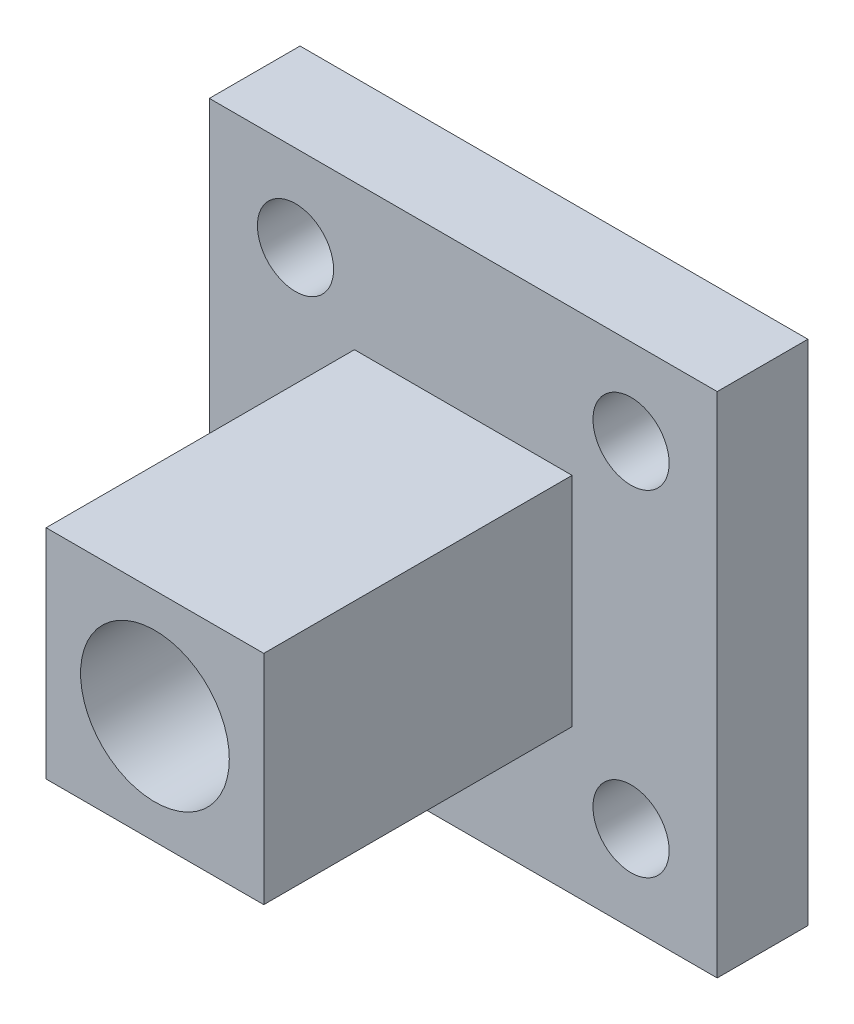
ISO-10303-21;
HEADER;
FILE_DESCRIPTION(('STEP AP214'),'2;1');
FILE_NAME('part.step','',(''),(''),'','','');
FILE_SCHEMA(('AUTOMOTIVE_DESIGN { 1 0 10303 214 1 1 1 1 }'));
ENDSEC;
DATA;
#1=APPLICATION_CONTEXT('core data for automotive mechanical design processes');
#2=APPLICATION_PROTOCOL_DEFINITION('international standard','automotive_design',2000,#1);
#3=PRODUCT_CONTEXT('',#1,'mechanical');
#4=PRODUCT('Part','Part','',(#3));
#5=PRODUCT_RELATED_PRODUCT_CATEGORY('part','',(#4));
#6=PRODUCT_DEFINITION_FORMATION('','',#4);
#7=PRODUCT_DEFINITION_CONTEXT('part definition',#1,'design');
#8=PRODUCT_DEFINITION('design','',#6,#7);
#9=PRODUCT_DEFINITION_SHAPE('','',#8);
#10=(LENGTH_UNIT() NAMED_UNIT(*) SI_UNIT(.MILLI.,.METRE.));
#11=(NAMED_UNIT(*) PLANE_ANGLE_UNIT() SI_UNIT($,.RADIAN.));
#12=(NAMED_UNIT(*) SI_UNIT($,.STERADIAN.) SOLID_ANGLE_UNIT());
#13=UNCERTAINTY_MEASURE_WITH_UNIT(LENGTH_MEASURE(1.E-05),#10,'distance_accuracy_value','');
#14=(GEOMETRIC_REPRESENTATION_CONTEXT(3) GLOBAL_UNCERTAINTY_ASSIGNED_CONTEXT((#13)) GLOBAL_UNIT_ASSIGNED_CONTEXT((#10,
#11,#12)) REPRESENTATION_CONTEXT('',''));
#15=CARTESIAN_POINT('',(0.,0.,0.));
#16=DIRECTION('',(0.,0.,1.));
#17=DIRECTION('',(1.,0.,0.));
#18=AXIS2_PLACEMENT_3D('',#15,#16,#17);
#19=CARTESIAN_POINT('',(0.,0.,5.));
#20=DIRECTION('',(0.,0.,1.));
#21=DIRECTION('',(1.,0.,0.));
#22=AXIS2_PLACEMENT_3D('',#19,#20,#21);
#23=PLANE('',#22);
#24=CARTESIAN_POINT('',(4.75,4.75,5.));
#25=DIRECTION('',(0.,0.,1.));
#26=DIRECTION('',(1.,0.,0.));
#27=AXIS2_PLACEMENT_3D('',#24,#25,#26);
#28=CIRCLE('',#27,2.1);
#29=CARTESIAN_POINT('',(6.85,4.75,5.));
#30=VERTEX_POINT('',#29);
#31=EDGE_CURVE('E159',#30,#30,#28,.F.);
#32=ORIENTED_EDGE('',*,*,#31,.T.);
#33=EDGE_LOOP('',(#32));
#34=FACE_BOUND('',#33,.T.);
#35=CARTESIAN_POINT('',(23.25,4.75,5.));
#36=DIRECTION('',(0.,0.,1.));
#37=DIRECTION('',(1.,0.,0.));
#38=AXIS2_PLACEMENT_3D('',#35,#36,#37);
#39=CIRCLE('',#38,2.1);
#40=CARTESIAN_POINT('',(25.35,4.75,5.));
#41=VERTEX_POINT('',#40);
#42=EDGE_CURVE('E156',#41,#41,#39,.T.);
#43=ORIENTED_EDGE('',*,*,#42,.F.);
#44=EDGE_LOOP('',(#43));
#45=FACE_BOUND('',#44,.T.);
#46=DIRECTION('',(1.,0.,0.));
#47=VECTOR('',#46,1.);
#48=CARTESIAN_POINT('',(0.,0.,5.));
#49=LINE('',#48,#47);
#50=CARTESIAN_POINT('',(0.,0.,5.));
#51=VERTEX_POINT('',#50);
#52=CARTESIAN_POINT('',(28.,0.,5.));
#53=VERTEX_POINT('',#52);
#54=EDGE_CURVE('E148',#51,#53,#49,.T.);
#55=ORIENTED_EDGE('',*,*,#54,.T.);
#56=DIRECTION('',(0.,1.,0.));
#57=VECTOR('',#56,1.);
#58=CARTESIAN_POINT('',(28.,0.,5.));
#59=LINE('',#58,#57);
#60=CARTESIAN_POINT('',(28.,28.,5.));
#61=VERTEX_POINT('',#60);
#62=EDGE_CURVE('E85',#53,#61,#59,.T.);
#63=ORIENTED_EDGE('',*,*,#62,.T.);
#64=DIRECTION('',(1.,0.,0.));
#65=VECTOR('',#64,1.);
#66=CARTESIAN_POINT('',(0.,28.,5.));
#67=LINE('',#66,#65);
#68=CARTESIAN_POINT('',(0.,28.,5.));
#69=VERTEX_POINT('',#68);
#70=EDGE_CURVE('E151',#69,#61,#67,.T.);
#71=ORIENTED_EDGE('',*,*,#70,.F.);
#72=DIRECTION('',(0.,1.,0.));
#73=VECTOR('',#72,1.);
#74=CARTESIAN_POINT('',(0.,0.,5.));
#75=LINE('',#74,#73);
#76=EDGE_CURVE('E154',#51,#69,#75,.T.);
#77=ORIENTED_EDGE('',*,*,#76,.F.);
#78=EDGE_LOOP('',(#55,#63,#71,#77));
#79=FACE_BOUND('',#78,.T.);
#80=CARTESIAN_POINT('',(4.75,23.25,5.));
#81=DIRECTION('',(0.,0.,1.));
#82=DIRECTION('',(1.,0.,0.));
#83=AXIS2_PLACEMENT_3D('',#80,#81,#82);
#84=CIRCLE('',#83,2.1);
#85=CARTESIAN_POINT('',(6.85,23.25,5.));
#86=VERTEX_POINT('',#85);
#87=EDGE_CURVE('E144',#86,#86,#84,.T.);
#88=ORIENTED_EDGE('',*,*,#87,.F.);
#89=EDGE_LOOP('',(#88));
#90=FACE_BOUND('',#89,.T.);
#91=CARTESIAN_POINT('',(23.25,23.25,5.));
#92=DIRECTION('',(0.,0.,1.));
#93=DIRECTION('',(1.,0.,0.));
#94=AXIS2_PLACEMENT_3D('',#91,#92,#93);
#95=CIRCLE('',#94,2.1);
#96=CARTESIAN_POINT('',(25.35,23.25,5.));
#97=VERTEX_POINT('',#96);
#98=EDGE_CURVE('E141',#97,#97,#95,.F.);
#99=ORIENTED_EDGE('',*,*,#98,.T.);
#100=EDGE_LOOP('',(#99));
#101=FACE_BOUND('',#100,.T.);
#102=DIRECTION('',(1.,0.,0.));
#103=VECTOR('',#102,1.);
#104=CARTESIAN_POINT('',(8.00000000000001,8.,5.));
#105=LINE('',#104,#103);
#106=CARTESIAN_POINT('',(8.00000000000001,8.,5.));
#107=VERTEX_POINT('',#106);
#108=CARTESIAN_POINT('',(20.,8.,5.));
#109=VERTEX_POINT('',#108);
#110=EDGE_CURVE('E346',#107,#109,#105,.T.);
#111=ORIENTED_EDGE('',*,*,#110,.F.);
#112=DIRECTION('',(0.,-1.,0.));
#113=VECTOR('',#112,1.);
#114=CARTESIAN_POINT('',(8.00000000000001,8.,5.));
#115=LINE('',#114,#113);
#116=CARTESIAN_POINT('',(8.,20.,5.));
#117=VERTEX_POINT('',#116);
#118=EDGE_CURVE('E131',#117,#107,#115,.T.);
#119=ORIENTED_EDGE('',*,*,#118,.F.);
#120=DIRECTION('',(-1.,0.,0.));
#121=VECTOR('',#120,1.);
#122=CARTESIAN_POINT('',(8.,20.,5.));
#123=LINE('',#122,#121);
#124=CARTESIAN_POINT('',(20.,20.,5.));
#125=VERTEX_POINT('',#124);
#126=EDGE_CURVE('E127',#125,#117,#123,.T.);
#127=ORIENTED_EDGE('',*,*,#126,.F.);
#128=DIRECTION('',(0.,1.,0.));
#129=VECTOR('',#128,1.);
#130=CARTESIAN_POINT('',(20.,8.,5.));
#131=LINE('',#130,#129);
#132=EDGE_CURVE('E355',#109,#125,#131,.T.);
#133=ORIENTED_EDGE('',*,*,#132,.F.);
#134=EDGE_LOOP('',(#111,#119,#127,#133));
#135=FACE_BOUND('',#134,.T.);
#136=ADVANCED_FACE('F35',(#34,#45,#79,#90,#101,#135),#23,.T.);
#137=CARTESIAN_POINT('',(0.,0.,5.));
#138=DIRECTION('',(0.,1.,0.));
#139=DIRECTION('',(0.,0.,1.));
#140=AXIS2_PLACEMENT_3D('',#137,#138,#139);
#141=PLANE('',#140);
#142=DIRECTION('',(1.,0.,0.));
#143=VECTOR('',#142,1.);
#144=CARTESIAN_POINT('',(0.,0.,0.));
#145=LINE('',#144,#143);
#146=CARTESIAN_POINT('',(0.,0.,0.));
#147=VERTEX_POINT('',#146);
#148=CARTESIAN_POINT('',(28.,0.,0.));
#149=VERTEX_POINT('',#148);
#150=EDGE_CURVE('E164',#147,#149,#145,.T.);
#151=ORIENTED_EDGE('',*,*,#150,.T.);
#152=DIRECTION('',(0.,0.,-1.));
#153=VECTOR('',#152,1.);
#154=CARTESIAN_POINT('',(28.,0.,5.));
#155=LINE('',#154,#153);
#156=EDGE_CURVE('E11',#53,#149,#155,.T.);
#157=ORIENTED_EDGE('',*,*,#156,.F.);
#158=ORIENTED_EDGE('',*,*,#54,.F.);
#159=DIRECTION('',(0.,0.,-1.));
#160=VECTOR('',#159,1.);
#161=CARTESIAN_POINT('',(0.,0.,5.));
#162=LINE('',#161,#160);
#163=EDGE_CURVE('E59',#51,#147,#162,.T.);
#164=ORIENTED_EDGE('',*,*,#163,.T.);
#165=EDGE_LOOP('',(#151,#157,#158,#164));
#166=FACE_BOUND('',#165,.T.);
#167=ADVANCED_FACE('F195',(#166),#141,.F.);
#168=CARTESIAN_POINT('',(28.,0.,5.));
#169=DIRECTION('',(-1.,0.,0.));
#170=DIRECTION('',(0.,0.,1.));
#171=AXIS2_PLACEMENT_3D('',#168,#169,#170);
#172=PLANE('',#171);
#173=DIRECTION('',(0.,1.,0.));
#174=VECTOR('',#173,1.);
#175=CARTESIAN_POINT('',(28.,0.,0.));
#176=LINE('',#175,#174);
#177=CARTESIAN_POINT('',(28.,28.,0.));
#178=VERTEX_POINT('',#177);
#179=EDGE_CURVE('E166',#149,#178,#176,.T.);
#180=ORIENTED_EDGE('',*,*,#179,.T.);
#181=DIRECTION('',(0.,0.,-1.));
#182=VECTOR('',#181,1.);
#183=CARTESIAN_POINT('',(28.,28.,5.));
#184=LINE('',#183,#182);
#185=EDGE_CURVE('E43',#61,#178,#184,.T.);
#186=ORIENTED_EDGE('',*,*,#185,.F.);
#187=ORIENTED_EDGE('',*,*,#62,.F.);
#188=ORIENTED_EDGE('',*,*,#156,.T.);
#189=EDGE_LOOP('',(#180,#186,#187,#188));
#190=FACE_BOUND('',#189,.T.);
#191=ADVANCED_FACE('F186',(#190),#172,.F.);
#192=CARTESIAN_POINT('',(0.,28.,5.));
#193=DIRECTION('',(0.,1.,0.));
#194=DIRECTION('',(0.,0.,1.));
#195=AXIS2_PLACEMENT_3D('',#192,#193,#194);
#196=PLANE('',#195);
#197=DIRECTION('',(1.,0.,0.));
#198=VECTOR('',#197,1.);
#199=CARTESIAN_POINT('',(0.,28.,0.));
#200=LINE('',#199,#198);
#201=CARTESIAN_POINT('',(0.,28.,0.));
#202=VERTEX_POINT('',#201);
#203=EDGE_CURVE('E169',#202,#178,#200,.T.);
#204=ORIENTED_EDGE('',*,*,#203,.F.);
#205=DIRECTION('',(0.,0.,-1.));
#206=VECTOR('',#205,1.);
#207=CARTESIAN_POINT('',(0.,28.,5.));
#208=LINE('',#207,#206);
#209=EDGE_CURVE('E181',#69,#202,#208,.T.);
#210=ORIENTED_EDGE('',*,*,#209,.F.);
#211=ORIENTED_EDGE('',*,*,#70,.T.);
#212=ORIENTED_EDGE('',*,*,#185,.T.);
#213=EDGE_LOOP('',(#204,#210,#211,#212));
#214=FACE_BOUND('',#213,.T.);
#215=ADVANCED_FACE('F184',(#214),#196,.T.);
#216=CARTESIAN_POINT('',(23.25,4.75,5.));
#217=DIRECTION('',(0.,0.,-1.));
#218=DIRECTION('',(-1.,0.,0.));
#219=AXIS2_PLACEMENT_3D('',#216,#217,#218);
#220=CYLINDRICAL_SURFACE('',#219,2.1);
#221=ORIENTED_EDGE('',*,*,#42,.T.);
#222=EDGE_LOOP('',(#221));
#223=FACE_BOUND('',#222,.T.);
#224=CARTESIAN_POINT('',(23.25,4.75,0.));
#225=DIRECTION('',(0.,0.,1.));
#226=DIRECTION('',(1.,0.,0.));
#227=AXIS2_PLACEMENT_3D('',#224,#225,#226);
#228=CIRCLE('',#227,2.1);
#229=CARTESIAN_POINT('',(25.35,4.75,0.));
#230=VERTEX_POINT('',#229);
#231=EDGE_CURVE('E175',#230,#230,#228,.T.);
#232=ORIENTED_EDGE('',*,*,#231,.F.);
#233=EDGE_LOOP('',(#232));
#234=FACE_BOUND('',#233,.T.);
#235=ADVANCED_FACE('F215',(#223,#234),#220,.F.);
#236=CARTESIAN_POINT('',(0.,0.,5.));
#237=DIRECTION('',(-1.,0.,0.));
#238=DIRECTION('',(0.,-1.,0.));
#239=AXIS2_PLACEMENT_3D('',#236,#237,#238);
#240=PLANE('',#239);
#241=DIRECTION('',(0.,1.,0.));
#242=VECTOR('',#241,1.);
#243=CARTESIAN_POINT('',(0.,0.,0.));
#244=LINE('',#243,#242);
#245=EDGE_CURVE('E172',#147,#202,#244,.T.);
#246=ORIENTED_EDGE('',*,*,#245,.F.);
#247=ORIENTED_EDGE('',*,*,#163,.F.);
#248=ORIENTED_EDGE('',*,*,#76,.T.);
#249=ORIENTED_EDGE('',*,*,#209,.T.);
#250=EDGE_LOOP('',(#246,#247,#248,#249));
#251=FACE_BOUND('',#250,.T.);
#252=ADVANCED_FACE('F191',(#251),#240,.T.);
#253=CARTESIAN_POINT('',(4.75,23.25,5.));
#254=DIRECTION('',(0.,0.,-1.));
#255=DIRECTION('',(-1.,0.,0.));
#256=AXIS2_PLACEMENT_3D('',#253,#254,#255);
#257=CYLINDRICAL_SURFACE('',#256,2.1);
#258=ORIENTED_EDGE('',*,*,#87,.T.);
#259=EDGE_LOOP('',(#258));
#260=FACE_BOUND('',#259,.T.);
#261=CARTESIAN_POINT('',(4.75,23.25,0.));
#262=DIRECTION('',(0.,0.,1.));
#263=DIRECTION('',(1.,0.,0.));
#264=AXIS2_PLACEMENT_3D('',#261,#262,#263);
#265=CIRCLE('',#264,2.1);
#266=CARTESIAN_POINT('',(6.85,23.25,0.));
#267=VERTEX_POINT('',#266);
#268=EDGE_CURVE('E136',#267,#267,#265,.T.);
#269=ORIENTED_EDGE('',*,*,#268,.F.);
#270=EDGE_LOOP('',(#269));
#271=FACE_BOUND('',#270,.T.);
#272=ADVANCED_FACE('F206',(#260,#271),#257,.F.);
#273=CARTESIAN_POINT('',(23.25,23.25,5.));
#274=DIRECTION('',(0.,0.,-1.));
#275=DIRECTION('',(-1.,0.,0.));
#276=AXIS2_PLACEMENT_3D('',#273,#274,#275);
#277=CYLINDRICAL_SURFACE('',#276,2.1);
#278=ORIENTED_EDGE('',*,*,#98,.F.);
#279=EDGE_LOOP('',(#278));
#280=FACE_BOUND('',#279,.T.);
#281=CARTESIAN_POINT('',(23.25,23.25,0.));
#282=DIRECTION('',(0.,0.,1.));
#283=DIRECTION('',(1.,0.,0.));
#284=AXIS2_PLACEMENT_3D('',#281,#282,#283);
#285=CIRCLE('',#284,2.1);
#286=CARTESIAN_POINT('',(25.35,23.25,0.));
#287=VERTEX_POINT('',#286);
#288=EDGE_CURVE('E133',#287,#287,#285,.F.);
#289=ORIENTED_EDGE('',*,*,#288,.T.);
#290=EDGE_LOOP('',(#289));
#291=FACE_BOUND('',#290,.T.);
#292=ADVANCED_FACE('F37',(#280,#291),#277,.F.);
#293=CARTESIAN_POINT('',(4.75,4.75,5.));
#294=DIRECTION('',(0.,0.,-1.));
#295=DIRECTION('',(-1.,0.,0.));
#296=AXIS2_PLACEMENT_3D('',#293,#294,#295);
#297=CYLINDRICAL_SURFACE('',#296,2.1);
#298=ORIENTED_EDGE('',*,*,#31,.F.);
#299=EDGE_LOOP('',(#298));
#300=FACE_BOUND('',#299,.T.);
#301=CARTESIAN_POINT('',(4.75,4.75,0.));
#302=DIRECTION('',(0.,0.,1.));
#303=DIRECTION('',(1.,0.,0.));
#304=AXIS2_PLACEMENT_3D('',#301,#302,#303);
#305=CIRCLE('',#304,2.1);
#306=CARTESIAN_POINT('',(6.85,4.75,0.));
#307=VERTEX_POINT('',#306);
#308=EDGE_CURVE('E145',#307,#307,#305,.F.);
#309=ORIENTED_EDGE('',*,*,#308,.T.);
#310=EDGE_LOOP('',(#309));
#311=FACE_BOUND('',#310,.T.);
#312=ADVANCED_FACE('F213',(#300,#311),#297,.F.);
#313=CARTESIAN_POINT('',(0.,0.,0.));
#314=DIRECTION('',(0.,0.,1.));
#315=DIRECTION('',(1.,0.,0.));
#316=AXIS2_PLACEMENT_3D('',#313,#314,#315);
#317=PLANE('',#316);
#318=ORIENTED_EDGE('',*,*,#288,.F.);
#319=EDGE_LOOP('',(#318));
#320=FACE_BOUND('',#319,.T.);
#321=ORIENTED_EDGE('',*,*,#268,.T.);
#322=EDGE_LOOP('',(#321));
#323=FACE_BOUND('',#322,.T.);
#324=ORIENTED_EDGE('',*,*,#150,.F.);
#325=ORIENTED_EDGE('',*,*,#245,.T.);
#326=ORIENTED_EDGE('',*,*,#203,.T.);
#327=ORIENTED_EDGE('',*,*,#179,.F.);
#328=EDGE_LOOP('',(#324,#325,#326,#327));
#329=FACE_BOUND('',#328,.T.);
#330=ORIENTED_EDGE('',*,*,#231,.T.);
#331=EDGE_LOOP('',(#330));
#332=FACE_BOUND('',#331,.T.);
#333=ORIENTED_EDGE('',*,*,#308,.F.);
#334=EDGE_LOOP('',(#333));
#335=FACE_BOUND('',#334,.T.);
#336=ADVANCED_FACE('F189',(#320,#323,#329,#332,#335),#317,.F.);
#337=CARTESIAN_POINT('',(8.00000000000001,8.,22.));
#338=DIRECTION('',(1.,0.,0.));
#339=DIRECTION('',(0.,1.,0.));
#340=AXIS2_PLACEMENT_3D('',#337,#338,#339);
#341=PLANE('',#340);
#342=ORIENTED_EDGE('',*,*,#118,.T.);
#343=DIRECTION('',(0.,0.,-1.));
#344=VECTOR('',#343,1.);
#345=CARTESIAN_POINT('',(8.00000000000001,8.,22.));
#346=LINE('',#345,#344);
#347=CARTESIAN_POINT('',(8.00000000000001,8.,22.));
#348=VERTEX_POINT('',#347);
#349=EDGE_CURVE('E112',#348,#107,#346,.T.);
#350=ORIENTED_EDGE('',*,*,#349,.F.);
#351=DIRECTION('',(0.,-1.,0.));
#352=VECTOR('',#351,1.);
#353=CARTESIAN_POINT('',(8.00000000000001,8.,22.));
#354=LINE('',#353,#352);
#355=CARTESIAN_POINT('',(8.,20.,22.));
#356=VERTEX_POINT('',#355);
#357=EDGE_CURVE('E119',#356,#348,#354,.T.);
#358=ORIENTED_EDGE('',*,*,#357,.F.);
#359=DIRECTION('',(0.,0.,-1.));
#360=VECTOR('',#359,1.);
#361=CARTESIAN_POINT('',(8.,20.,22.));
#362=LINE('',#361,#360);
#363=EDGE_CURVE('E352',#356,#117,#362,.T.);
#364=ORIENTED_EDGE('',*,*,#363,.T.);
#365=EDGE_LOOP('',(#342,#350,#358,#364));
#366=FACE_BOUND('',#365,.T.);
#367=ADVANCED_FACE('F129',(#366),#341,.F.);
#368=CARTESIAN_POINT('',(8.00000000000001,8.,22.));
#369=DIRECTION('',(0.,1.,0.));
#370=DIRECTION('',(-1.,0.,0.));
#371=AXIS2_PLACEMENT_3D('',#368,#369,#370);
#372=PLANE('',#371);
#373=ORIENTED_EDGE('',*,*,#110,.T.);
#374=DIRECTION('',(0.,0.,-1.));
#375=VECTOR('',#374,1.);
#376=CARTESIAN_POINT('',(20.,8.,22.));
#377=LINE('',#376,#375);
#378=CARTESIAN_POINT('',(20.,8.,22.));
#379=VERTEX_POINT('',#378);
#380=EDGE_CURVE('E115',#379,#109,#377,.T.);
#381=ORIENTED_EDGE('',*,*,#380,.F.);
#382=DIRECTION('',(1.,0.,0.));
#383=VECTOR('',#382,1.);
#384=CARTESIAN_POINT('',(8.00000000000001,8.,22.));
#385=LINE('',#384,#383);
#386=EDGE_CURVE('E108',#348,#379,#385,.T.);
#387=ORIENTED_EDGE('',*,*,#386,.F.);
#388=ORIENTED_EDGE('',*,*,#349,.T.);
#389=EDGE_LOOP('',(#373,#381,#387,#388));
#390=FACE_BOUND('',#389,.T.);
#391=ADVANCED_FACE('F110',(#390),#372,.F.);
#392=CARTESIAN_POINT('',(20.,8.,22.));
#393=DIRECTION('',(-1.,0.,0.));
#394=DIRECTION('',(0.,-1.,0.));
#395=AXIS2_PLACEMENT_3D('',#392,#393,#394);
#396=PLANE('',#395);
#397=ORIENTED_EDGE('',*,*,#132,.T.);
#398=DIRECTION('',(0.,0.,-1.));
#399=VECTOR('',#398,1.);
#400=CARTESIAN_POINT('',(20.,20.,22.));
#401=LINE('',#400,#399);
#402=CARTESIAN_POINT('',(20.,20.,22.));
#403=VERTEX_POINT('',#402);
#404=EDGE_CURVE('E50',#403,#125,#401,.T.);
#405=ORIENTED_EDGE('',*,*,#404,.F.);
#406=DIRECTION('',(0.,1.,0.));
#407=VECTOR('',#406,1.);
#408=CARTESIAN_POINT('',(20.,8.,22.));
#409=LINE('',#408,#407);
#410=EDGE_CURVE('E118',#379,#403,#409,.T.);
#411=ORIENTED_EDGE('',*,*,#410,.F.);
#412=ORIENTED_EDGE('',*,*,#380,.T.);
#413=EDGE_LOOP('',(#397,#405,#411,#412));
#414=FACE_BOUND('',#413,.T.);
#415=ADVANCED_FACE('F290',(#414),#396,.F.);
#416=CARTESIAN_POINT('',(8.,20.,22.));
#417=DIRECTION('',(0.,-1.,0.));
#418=DIRECTION('',(0.,0.,-1.));
#419=AXIS2_PLACEMENT_3D('',#416,#417,#418);
#420=PLANE('',#419);
#421=ORIENTED_EDGE('',*,*,#126,.T.);
#422=ORIENTED_EDGE('',*,*,#363,.F.);
#423=DIRECTION('',(-1.,0.,0.));
#424=VECTOR('',#423,1.);
#425=CARTESIAN_POINT('',(8.,20.,22.));
#426=LINE('',#425,#424);
#427=EDGE_CURVE('E123',#403,#356,#426,.T.);
#428=ORIENTED_EDGE('',*,*,#427,.F.);
#429=ORIENTED_EDGE('',*,*,#404,.T.);
#430=EDGE_LOOP('',(#421,#422,#428,#429));
#431=FACE_BOUND('',#430,.T.);
#432=ADVANCED_FACE('F299',(#431),#420,.F.);
#433=CARTESIAN_POINT('',(0.,0.,22.));
#434=DIRECTION('',(0.,0.,-1.));
#435=DIRECTION('',(-1.,0.,0.));
#436=AXIS2_PLACEMENT_3D('',#433,#434,#435);
#437=PLANE('',#436);
#438=CARTESIAN_POINT('',(14.,14.,22.));
#439=DIRECTION('',(0.,0.,1.));
#440=DIRECTION('',(1.,0.,0.));
#441=AXIS2_PLACEMENT_3D('',#438,#439,#440);
#442=CIRCLE('',#441,4.1);
#443=CARTESIAN_POINT('',(18.1,14.,22.));
#444=VERTEX_POINT('',#443);
#445=EDGE_CURVE('E344',#444,#444,#442,.T.);
#446=ORIENTED_EDGE('',*,*,#445,.F.);
#447=EDGE_LOOP('',(#446));
#448=FACE_BOUND('',#447,.T.);
#449=ORIENTED_EDGE('',*,*,#357,.T.);
#450=ORIENTED_EDGE('',*,*,#386,.T.);
#451=ORIENTED_EDGE('',*,*,#410,.T.);
#452=ORIENTED_EDGE('',*,*,#427,.T.);
#453=EDGE_LOOP('',(#449,#450,#451,#452));
#454=FACE_BOUND('',#453,.T.);
#455=ADVANCED_FACE('F122',(#448,#454),#437,.F.);
#456=CARTESIAN_POINT('',(14.,14.,5.));
#457=DIRECTION('',(0.,0.,1.));
#458=DIRECTION('',(1.,0.,0.));
#459=AXIS2_PLACEMENT_3D('',#456,#457,#458);
#460=CYLINDRICAL_SURFACE('',#459,4.1);
#461=CARTESIAN_POINT('',(14.,14.,5.));
#462=DIRECTION('',(0.,0.,1.));
#463=DIRECTION('',(1.,0.,0.));
#464=AXIS2_PLACEMENT_3D('',#461,#462,#463);
#465=CIRCLE('',#464,4.1);
#466=CARTESIAN_POINT('',(18.1,14.,5.));
#467=VERTEX_POINT('',#466);
#468=EDGE_CURVE('E343',#467,#467,#465,.T.);
#469=ORIENTED_EDGE('',*,*,#468,.F.);
#470=EDGE_LOOP('',(#469));
#471=FACE_BOUND('',#470,.T.);
#472=ORIENTED_EDGE('',*,*,#445,.T.);
#473=EDGE_LOOP('',(#472));
#474=FACE_BOUND('',#473,.T.);
#475=ADVANCED_FACE('F317',(#471,#474),#460,.F.);
#476=CARTESIAN_POINT('',(14.,14.,5.));
#477=DIRECTION('',(0.,0.,1.));
#478=DIRECTION('',(1.,0.,0.));
#479=AXIS2_PLACEMENT_3D('',#476,#477,#478);
#480=PLANE('',#479);
#481=ORIENTED_EDGE('',*,*,#468,.T.);
#482=EDGE_LOOP('',(#481));
#483=FACE_BOUND('',#482,.T.);
#484=ADVANCED_FACE('F327',(#483),#480,.T.);
#485=CLOSED_SHELL('',(#136,#167,#191,#215,#235,#252,#272,#292,#312,#336,#367,#391,#415,#432,
#455,#475,#484));
#486=MANIFOLD_SOLID_BREP('B2',#485);
#487=ADVANCED_BREP_SHAPE_REPRESENTATION('',(#18,#486),#14);
#488=SHAPE_DEFINITION_REPRESENTATION(#9,#487);
ENDSEC;
END-ISO-10303-21;
